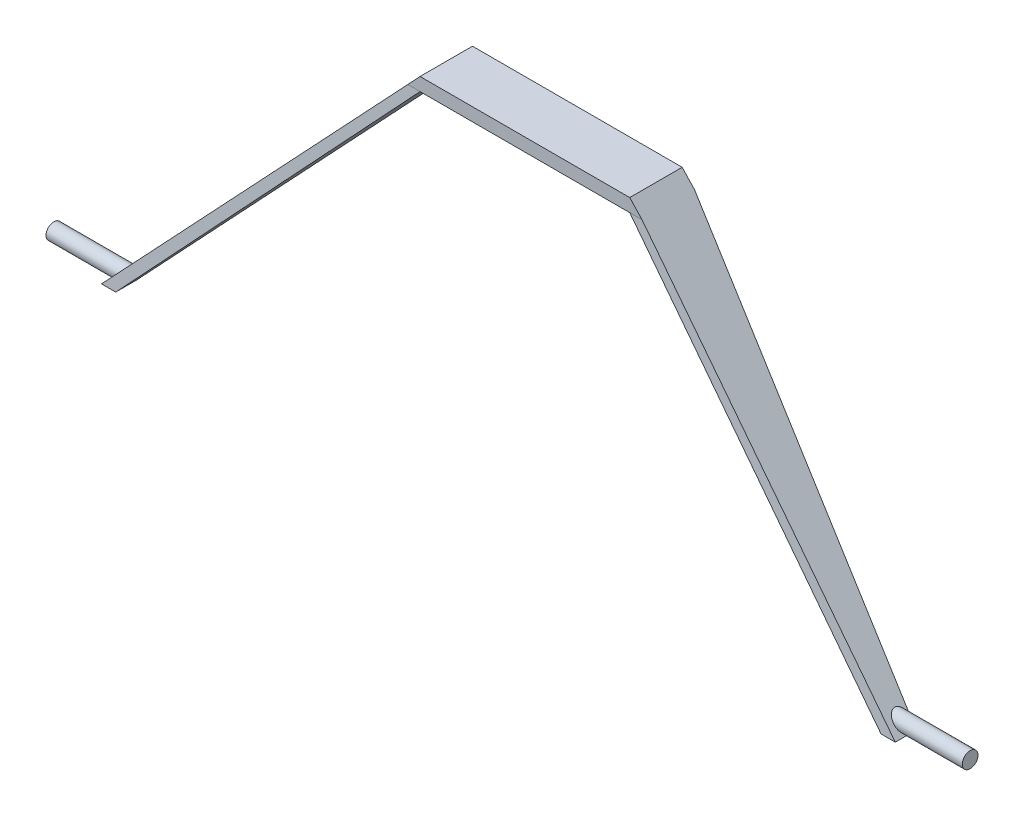
ISO-10303-21;
HEADER;
FILE_DESCRIPTION(('STEP AP214'),'2;1');
FILE_NAME('part.step','',(''),(''),'','','');
FILE_SCHEMA(('AUTOMOTIVE_DESIGN { 1 0 10303 214 1 1 1 1 }'));
ENDSEC;
DATA;
#1=APPLICATION_CONTEXT('core data for automotive mechanical design processes');
#2=APPLICATION_PROTOCOL_DEFINITION('international standard','automotive_design',2000,#1);
#3=PRODUCT_CONTEXT('',#1,'mechanical');
#4=PRODUCT('Part','Part','',(#3));
#5=PRODUCT_RELATED_PRODUCT_CATEGORY('part','',(#4));
#6=PRODUCT_DEFINITION_FORMATION('','',#4);
#7=PRODUCT_DEFINITION_CONTEXT('part definition',#1,'design');
#8=PRODUCT_DEFINITION('design','',#6,#7);
#9=PRODUCT_DEFINITION_SHAPE('','',#8);
#10=(LENGTH_UNIT() NAMED_UNIT(*) SI_UNIT(.MILLI.,.METRE.));
#11=(NAMED_UNIT(*) PLANE_ANGLE_UNIT() SI_UNIT($,.RADIAN.));
#12=(NAMED_UNIT(*) SI_UNIT($,.STERADIAN.) SOLID_ANGLE_UNIT());
#13=UNCERTAINTY_MEASURE_WITH_UNIT(LENGTH_MEASURE(1.E-05),#10,'distance_accuracy_value','');
#14=(GEOMETRIC_REPRESENTATION_CONTEXT(3) GLOBAL_UNCERTAINTY_ASSIGNED_CONTEXT((#13)) GLOBAL_UNIT_ASSIGNED_CONTEXT((#10,
#11,#12)) REPRESENTATION_CONTEXT('',''));
#15=CARTESIAN_POINT('',(0.,0.,0.));
#16=DIRECTION('',(0.,0.,1.));
#17=DIRECTION('',(1.,0.,0.));
#18=AXIS2_PLACEMENT_3D('',#15,#16,#17);
#19=CARTESIAN_POINT('',(203.2,241.3,-101.6));
#20=DIRECTION('',(0.730491181160132,0.682922128977584,0.));
#21=DIRECTION('',(-0.682922128977584,0.730491181160132,0.));
#22=AXIS2_PLACEMENT_3D('',#19,#20,#21);
#23=PLANE('',#22);
#24=DIRECTION('',(0.,0.,1.));
#25=VECTOR('',#24,1.);
#26=CARTESIAN_POINT('',(769.187266427381,-364.111201703355,-101.6));
#27=LINE('',#26,#25);
#28=CARTESIAN_POINT('',(769.18726642738,-364.111201703354,10.9518570639748));
#29=VERTEX_POINT('',#28);
#30=CARTESIAN_POINT('',(769.187266427381,-364.111201703355,51.3823695292059));
#31=VERTEX_POINT('',#30);
#32=EDGE_CURVE('E233',#29,#31,#27,.T.);
#33=ORIENTED_EDGE('',*,*,#32,.F.);
#34=DIRECTION('',(0.676162571687912,-0.723260785805915,0.140349607636784));
#35=VECTOR('',#34,1.);
#36=CARTESIAN_POINT('',(716.188478747164,-307.420774830618,-0.0489870637551265));
#37=LINE('',#36,#35);
#38=CARTESIAN_POINT('',(226.945970551598,215.9,-101.6));
#39=VERTEX_POINT('',#38);
#40=EDGE_CURVE('E215',#39,#29,#37,.T.);
#41=ORIENTED_EDGE('',*,*,#40,.F.);
#42=DIRECTION('',(-0.682922128977583,0.730491181160132,0.));
#43=VECTOR('',#42,1.);
#44=CARTESIAN_POINT('',(203.2,241.3,-101.6));
#45=LINE('',#44,#43);
#46=CARTESIAN_POINT('',(203.2,241.3,-101.6));
#47=VERTEX_POINT('',#46);
#48=EDGE_CURVE('E165',#39,#47,#45,.T.);
#49=ORIENTED_EDGE('',*,*,#48,.T.);
#50=DIRECTION('',(0.,0.,1.));
#51=VECTOR('',#50,1.);
#52=CARTESIAN_POINT('',(203.2,241.3,-101.6));
#53=LINE('',#52,#51);
#54=CARTESIAN_POINT('',(203.2,241.3,0.));
#55=VERTEX_POINT('',#54);
#56=EDGE_CURVE('E155',#47,#55,#53,.T.);
#57=ORIENTED_EDGE('',*,*,#56,.T.);
#58=DIRECTION('',(-0.682922128977584,0.730491181160132,0.));
#59=VECTOR('',#58,1.);
#60=CARTESIAN_POINT('',(713.347967728877,-304.382407554465,0.));
#61=LINE('',#60,#59);
#62=CARTESIAN_POINT('',(226.945970551598,215.9,0.));
#63=VERTEX_POINT('',#62);
#64=EDGE_CURVE('E207',#63,#55,#61,.T.);
#65=ORIENTED_EDGE('',*,*,#64,.F.);
#66=DIRECTION('',(-0.681496635621806,0.728966394832361,-0.0645780987740408));
#67=VECTOR('',#66,1.);
#68=CARTESIAN_POINT('',(723.937929376008,-315.71001470586,47.094577037175));
#69=LINE('',#68,#67);
#70=EDGE_CURVE('E203',#31,#63,#69,.T.);
#71=ORIENTED_EDGE('',*,*,#70,.F.);
#72=EDGE_LOOP('',(#33,#41,#49,#57,#65,#71));
#73=FACE_BOUND('',#72,.T.);
#74=CARTESIAN_POINT('',(754.684005766055,-348.59771405722,23.6894465081378));
#75=DIRECTION('',(0.730491181160132,0.682922128977584,0.));
#76=DIRECTION('',(0.682922128977584,-0.730491181160132,0.));
#77=AXIS2_PLACEMENT_3D('',#74,#75,#76);
#78=ELLIPSE('',#77,20.8626748591222,15.24);
#79=CARTESIAN_POINT('',(768.931588097014,-363.83771405722,23.6894465081378));
#80=VERTEX_POINT('',#79);
#81=EDGE_CURVE('E11',#80,#80,#78,.F.);
#82=ORIENTED_EDGE('',*,*,#81,.T.);
#83=EDGE_LOOP('',(#82));
#84=FACE_BOUND('',#83,.T.);
#85=ADVANCED_FACE('F41',(#73,#84),#23,.T.);
#86=CARTESIAN_POINT('',(-203.2,241.3,-101.6));
#87=DIRECTION('',(-0.730491181160132,0.682922128977583,0.));
#88=DIRECTION('',(-0.682922128977583,-0.730491181160132,0.));
#89=AXIS2_PLACEMENT_3D('',#86,#87,#88);
#90=PLANE('',#89);
#91=DIRECTION('',(0.,0.,-1.));
#92=VECTOR('',#91,1.);
#93=CARTESIAN_POINT('',(-769.187266427381,-364.111201703355,-101.6));
#94=LINE('',#93,#92);
#95=CARTESIAN_POINT('',(-769.187266427381,-364.111201703355,51.3823695292059));
#96=VERTEX_POINT('',#95);
#97=CARTESIAN_POINT('',(-769.187266427381,-364.111201703355,23.7425171080954));
#98=VERTEX_POINT('',#97);
#99=EDGE_CURVE('E120',#96,#98,#94,.T.);
#100=ORIENTED_EDGE('',*,*,#99,.F.);
#101=DIRECTION('',(0.681496635621806,0.728966394832361,-0.0645780987740409));
#102=VECTOR('',#101,1.);
#103=CARTESIAN_POINT('',(-723.937929376007,-315.71001470586,47.094577037175));
#104=LINE('',#103,#102);
#105=CARTESIAN_POINT('',(-226.945970551598,215.9,0.));
#106=VERTEX_POINT('',#105);
#107=EDGE_CURVE('E200',#96,#106,#104,.T.);
#108=ORIENTED_EDGE('',*,*,#107,.T.);
#109=DIRECTION('',(0.682922128977583,0.730491181160132,0.));
#110=VECTOR('',#109,1.);
#111=CARTESIAN_POINT('',(-713.347967728877,-304.382407554465,0.));
#112=LINE('',#111,#110);
#113=CARTESIAN_POINT('',(-203.2,241.3,0.));
#114=VERTEX_POINT('',#113);
#115=EDGE_CURVE('E194',#106,#114,#112,.T.);
#116=ORIENTED_EDGE('',*,*,#115,.T.);
#117=DIRECTION('',(0.,0.,1.));
#118=VECTOR('',#117,1.);
#119=CARTESIAN_POINT('',(-203.2,241.3,-101.6));
#120=LINE('',#119,#118);
#121=CARTESIAN_POINT('',(-203.2,241.3,-101.6));
#122=VERTEX_POINT('',#121);
#123=EDGE_CURVE('E143',#122,#114,#120,.T.);
#124=ORIENTED_EDGE('',*,*,#123,.F.);
#125=DIRECTION('',(-0.682922128977583,-0.730491181160132,0.));
#126=VECTOR('',#125,1.);
#127=CARTESIAN_POINT('',(-203.2,241.3,-101.6));
#128=LINE('',#127,#126);
#129=CARTESIAN_POINT('',(-226.945970551598,215.9,-101.6));
#130=VERTEX_POINT('',#129);
#131=EDGE_CURVE('E172',#122,#130,#128,.T.);
#132=ORIENTED_EDGE('',*,*,#131,.T.);
#133=DIRECTION('',(-0.676162571687912,-0.723260785805915,0.140349607636784));
#134=VECTOR('',#133,1.);
#135=CARTESIAN_POINT('',(-716.188478747163,-307.420774830618,-0.048987063755182));
#136=LINE('',#135,#134);
#137=CARTESIAN_POINT('',(-769.187266427381,-364.111201703355,10.9518570639749));
#138=VERTEX_POINT('',#137);
#139=EDGE_CURVE('E133',#130,#138,#136,.T.);
#140=ORIENTED_EDGE('',*,*,#139,.T.);
#141=EDGE_CURVE('E57',#98,#138,#94,.T.);
#142=ORIENTED_EDGE('',*,*,#141,.F.);
#143=CARTESIAN_POINT('',(-754.939684096422,-348.871201703355,23.7425171080954));
#144=DIRECTION('',(-0.730491181160132,0.682922128977583,0.));
#145=DIRECTION('',(-0.682922128977583,-0.730491181160132,0.));
#146=AXIS2_PLACEMENT_3D('',#143,#144,#145);
#147=ELLIPSE('',#146,20.8626748591222,15.24);
#148=EDGE_CURVE('E50',#98,#98,#147,.T.);
#149=ORIENTED_EDGE('',*,*,#148,.F.);
#150=EDGE_LOOP('',(#100,#108,#116,#124,#132,#140,#142,#149));
#151=FACE_BOUND('',#150,.T.);
#152=ADVANCED_FACE('F43',(#151),#90,.T.);
#153=CARTESIAN_POINT('',(-203.2,241.3,-101.6));
#154=DIRECTION('',(0.,1.,0.));
#155=DIRECTION('',(-1.,0.,0.));
#156=AXIS2_PLACEMENT_3D('',#153,#154,#155);
#157=PLANE('',#156);
#158=DIRECTION('',(1.,0.,0.));
#159=VECTOR('',#158,1.);
#160=CARTESIAN_POINT('',(-1297.03997230565,241.3,0.));
#161=LINE('',#160,#159);
#162=EDGE_CURVE('E189',#114,#55,#161,.T.);
#163=ORIENTED_EDGE('',*,*,#162,.T.);
#164=ORIENTED_EDGE('',*,*,#56,.F.);
#165=DIRECTION('',(-1.,0.,0.));
#166=VECTOR('',#165,1.);
#167=CARTESIAN_POINT('',(-203.2,241.3,-101.6));
#168=LINE('',#167,#166);
#169=EDGE_CURVE('E151',#47,#122,#168,.T.);
#170=ORIENTED_EDGE('',*,*,#169,.T.);
#171=ORIENTED_EDGE('',*,*,#123,.T.);
#172=EDGE_LOOP('',(#163,#164,#170,#171));
#173=FACE_BOUND('',#172,.T.);
#174=ADVANCED_FACE('F282',(#173),#157,.T.);
#175=CARTESIAN_POINT('',(762.071663752112,-386.209201703355,-101.6));
#176=DIRECTION('',(-0.732932920293633,-0.680300914559025,0.));
#177=DIRECTION('',(0.680300914559025,-0.732932920293633,0.));
#178=AXIS2_PLACEMENT_3D('',#175,#176,#177);
#179=PLANE('',#178);
#180=DIRECTION('',(0.,0.,-1.));
#181=VECTOR('',#180,1.);
#182=CARTESIAN_POINT('',(741.56052392788,-364.111201703355,-101.6));
#183=LINE('',#182,#181);
#184=CARTESIAN_POINT('',(741.56052392788,-364.111201703355,51.3823695292059));
#185=VERTEX_POINT('',#184);
#186=CARTESIAN_POINT('',(741.560523927879,-364.111201703354,10.9518570639748));
#187=VERTEX_POINT('',#186);
#188=EDGE_CURVE('E65',#185,#187,#183,.T.);
#189=ORIENTED_EDGE('',*,*,#188,.F.);
#190=DIRECTION('',(0.678871413535743,-0.731392824819506,0.0647930527643605));
#191=VECTOR('',#190,1.);
#192=CARTESIAN_POINT('',(755.256449466988,-378.866723100837,52.6895402369698));
#193=LINE('',#192,#191);
#194=CARTESIAN_POINT('',(203.2,215.9,0.));
#195=VERTEX_POINT('',#194);
#196=EDGE_CURVE('E182',#195,#185,#193,.T.);
#197=ORIENTED_EDGE('',*,*,#196,.F.);
#198=DIRECTION('',(0.,0.,1.));
#199=VECTOR('',#198,1.);
#200=CARTESIAN_POINT('',(203.2,215.9,-101.6));
#201=LINE('',#200,#199);
#202=CARTESIAN_POINT('',(203.2,215.9,-101.6));
#203=VERTEX_POINT('',#202);
#204=EDGE_CURVE('E150',#203,#195,#201,.T.);
#205=ORIENTED_EDGE('',*,*,#204,.F.);
#206=DIRECTION('',(-0.673522882906171,0.725630500986452,-0.140809453659583));
#207=VECTOR('',#206,1.);
#208=CARTESIAN_POINT('',(750.990746361577,-374.271000579751,12.9233780062889));
#209=LINE('',#208,#207);
#210=EDGE_CURVE('E175',#187,#203,#209,.T.);
#211=ORIENTED_EDGE('',*,*,#210,.F.);
#212=EDGE_LOOP('',(#189,#197,#205,#211));
#213=FACE_BOUND('',#212,.T.);
#214=ADVANCED_FACE('F289',(#213),#179,.T.);
#215=CARTESIAN_POINT('',(-203.2,215.9,-101.6));
#216=DIRECTION('',(0.,-1.,0.));
#217=DIRECTION('',(1.,0.,0.));
#218=AXIS2_PLACEMENT_3D('',#215,#216,#217);
#219=PLANE('',#218);
#220=DIRECTION('',(1.,0.,0.));
#221=VECTOR('',#220,1.);
#222=CARTESIAN_POINT('',(-1297.03997230565,215.9,0.));
#223=LINE('',#222,#221);
#224=CARTESIAN_POINT('',(-203.2,215.9,0.));
#225=VERTEX_POINT('',#224);
#226=EDGE_CURVE('E195',#225,#195,#223,.T.);
#227=ORIENTED_EDGE('',*,*,#226,.F.);
#228=DIRECTION('',(0.,0.,1.));
#229=VECTOR('',#228,1.);
#230=CARTESIAN_POINT('',(-203.2,215.9,-101.6));
#231=LINE('',#230,#229);
#232=CARTESIAN_POINT('',(-203.2,215.9,-101.6));
#233=VERTEX_POINT('',#232);
#234=EDGE_CURVE('E146',#233,#225,#231,.T.);
#235=ORIENTED_EDGE('',*,*,#234,.F.);
#236=DIRECTION('',(1.,0.,0.));
#237=VECTOR('',#236,1.);
#238=CARTESIAN_POINT('',(-203.2,215.9,-101.6));
#239=LINE('',#238,#237);
#240=EDGE_CURVE('E168',#233,#203,#239,.T.);
#241=ORIENTED_EDGE('',*,*,#240,.T.);
#242=ORIENTED_EDGE('',*,*,#204,.T.);
#243=EDGE_LOOP('',(#227,#235,#241,#242));
#244=FACE_BOUND('',#243,.T.);
#245=ADVANCED_FACE('F266',(#244),#219,.T.);
#246=CARTESIAN_POINT('',(-762.071663752112,-386.209201703355,-101.6));
#247=DIRECTION('',(0.732932920293634,-0.680300914559025,0.));
#248=DIRECTION('',(0.680300914559025,0.732932920293634,0.));
#249=AXIS2_PLACEMENT_3D('',#246,#247,#248);
#250=PLANE('',#249);
#251=DIRECTION('',(0.,0.,1.));
#252=VECTOR('',#251,1.);
#253=CARTESIAN_POINT('',(-741.56052392788,-364.111201703355,-101.6));
#254=LINE('',#253,#252);
#255=CARTESIAN_POINT('',(-741.56052392788,-364.111201703355,10.9518570639749));
#256=VERTEX_POINT('',#255);
#257=CARTESIAN_POINT('',(-741.56052392788,-364.111201703355,51.3823695292059));
#258=VERTEX_POINT('',#257);
#259=EDGE_CURVE('E242',#256,#258,#254,.T.);
#260=ORIENTED_EDGE('',*,*,#259,.F.);
#261=DIRECTION('',(-0.673522882906171,-0.725630500986452,0.140809453659583));
#262=VECTOR('',#261,1.);
#263=CARTESIAN_POINT('',(-750.990746361577,-374.271000579751,12.9233780062889));
#264=LINE('',#263,#262);
#265=EDGE_CURVE('E178',#233,#256,#264,.T.);
#266=ORIENTED_EDGE('',*,*,#265,.F.);
#267=ORIENTED_EDGE('',*,*,#234,.T.);
#268=DIRECTION('',(0.678871413535743,0.731392824819506,-0.0647930527643606));
#269=VECTOR('',#268,1.);
#270=CARTESIAN_POINT('',(-755.256449466988,-378.866723100838,52.6895402369698));
#271=LINE('',#270,#269);
#272=EDGE_CURVE('E186',#258,#225,#271,.T.);
#273=ORIENTED_EDGE('',*,*,#272,.F.);
#274=EDGE_LOOP('',(#260,#266,#267,#273));
#275=FACE_BOUND('',#274,.T.);
#276=ADVANCED_FACE('F253',(#275),#250,.T.);
#277=CARTESIAN_POINT('',(0.,0.,-101.6));
#278=DIRECTION('',(0.,0.,1.));
#279=DIRECTION('',(1.,0.,0.));
#280=AXIS2_PLACEMENT_3D('',#277,#278,#279);
#281=PLANE('',#280);
#282=ORIENTED_EDGE('',*,*,#48,.F.);
#283=DIRECTION('',(-1.,0.,0.));
#284=VECTOR('',#283,1.);
#285=CARTESIAN_POINT('',(0.,215.9,-101.6));
#286=LINE('',#285,#284);
#287=EDGE_CURVE('E140',#39,#203,#286,.T.);
#288=ORIENTED_EDGE('',*,*,#287,.T.);
#289=ORIENTED_EDGE('',*,*,#240,.F.);
#290=DIRECTION('',(1.,0.,0.));
#291=VECTOR('',#290,1.);
#292=CARTESIAN_POINT('',(-1297.03997230565,215.9,-101.6));
#293=LINE('',#292,#291);
#294=EDGE_CURVE('E212',#130,#233,#293,.T.);
#295=ORIENTED_EDGE('',*,*,#294,.F.);
#296=ORIENTED_EDGE('',*,*,#131,.F.);
#297=ORIENTED_EDGE('',*,*,#169,.F.);
#298=EDGE_LOOP('',(#282,#288,#289,#295,#296,#297));
#299=FACE_BOUND('',#298,.T.);
#300=ADVANCED_FACE('F285',(#299),#281,.F.);
#301=CARTESIAN_POINT('',(-1297.03997230565,215.9,0.));
#302=DIRECTION('',(0.,-0.0882429953418222,-0.996098977899839));
#303=DIRECTION('',(0.,0.996098977899839,-0.0882429953418222));
#304=AXIS2_PLACEMENT_3D('',#301,#302,#303);
#305=PLANE('',#304);
#306=ORIENTED_EDGE('',*,*,#196,.T.);
#307=DIRECTION('',(1.,0.,0.));
#308=VECTOR('',#307,1.);
#309=CARTESIAN_POINT('',(-1297.03997230565,-364.111201703355,51.3823695292059));
#310=LINE('',#309,#308);
#311=EDGE_CURVE('E229',#185,#31,#310,.T.);
#312=ORIENTED_EDGE('',*,*,#311,.T.);
#313=ORIENTED_EDGE('',*,*,#70,.T.);
#314=EDGE_CURVE('E196',#195,#63,#223,.T.);
#315=ORIENTED_EDGE('',*,*,#314,.F.);
#316=EDGE_LOOP('',(#306,#312,#313,#315));
#317=FACE_BOUND('',#316,.T.);
#318=ADVANCED_FACE('F290',(#317),#305,.F.);
#319=ORIENTED_EDGE('',*,*,#107,.F.);
#320=DIRECTION('',(1.,0.,0.));
#321=VECTOR('',#320,1.);
#322=CARTESIAN_POINT('',(-1297.03997230565,-364.111201703355,51.3823695292059));
#323=LINE('',#322,#321);
#324=EDGE_CURVE('E123',#96,#258,#323,.T.);
#325=ORIENTED_EDGE('',*,*,#324,.T.);
#326=ORIENTED_EDGE('',*,*,#272,.T.);
#327=EDGE_CURVE('E190',#106,#225,#223,.T.);
#328=ORIENTED_EDGE('',*,*,#327,.F.);
#329=EDGE_LOOP('',(#319,#325,#326,#328));
#330=FACE_BOUND('',#329,.T.);
#331=ADVANCED_FACE('F257',(#330),#305,.F.);
#332=CARTESIAN_POINT('',(-1297.03997230565,241.3,0.));
#333=DIRECTION('',(0.,0.,-1.));
#334=DIRECTION('',(-1.,0.,0.));
#335=AXIS2_PLACEMENT_3D('',#332,#333,#334);
#336=PLANE('',#335);
#337=ORIENTED_EDGE('',*,*,#327,.T.);
#338=ORIENTED_EDGE('',*,*,#226,.T.);
#339=ORIENTED_EDGE('',*,*,#314,.T.);
#340=ORIENTED_EDGE('',*,*,#64,.T.);
#341=ORIENTED_EDGE('',*,*,#162,.F.);
#342=ORIENTED_EDGE('',*,*,#115,.F.);
#343=EDGE_LOOP('',(#337,#338,#339,#340,#341,#342));
#344=FACE_BOUND('',#343,.T.);
#345=ADVANCED_FACE('F262',(#344),#336,.F.);
#346=CARTESIAN_POINT('',(-1297.03997230565,215.9,-101.6));
#347=DIRECTION('',(0.,0.190497645594452,0.981687652475557));
#348=DIRECTION('',(0.,-0.981687652475557,0.190497645594452));
#349=AXIS2_PLACEMENT_3D('',#346,#347,#348);
#350=PLANE('',#349);
#351=ORIENTED_EDGE('',*,*,#265,.T.);
#352=DIRECTION('',(-1.,0.,0.));
#353=VECTOR('',#352,1.);
#354=CARTESIAN_POINT('',(-1297.03997230565,-364.111201703355,10.9518570639748));
#355=LINE('',#354,#353);
#356=EDGE_CURVE('E135',#256,#138,#355,.T.);
#357=ORIENTED_EDGE('',*,*,#356,.T.);
#358=ORIENTED_EDGE('',*,*,#139,.F.);
#359=ORIENTED_EDGE('',*,*,#294,.T.);
#360=EDGE_LOOP('',(#351,#357,#358,#359));
#361=FACE_BOUND('',#360,.T.);
#362=ADVANCED_FACE('F247',(#361),#350,.F.);
#363=ORIENTED_EDGE('',*,*,#40,.T.);
#364=DIRECTION('',(-1.,0.,0.));
#365=VECTOR('',#364,1.);
#366=CARTESIAN_POINT('',(-1297.03997230565,-364.111201703355,10.9518570639748));
#367=LINE('',#366,#365);
#368=EDGE_CURVE('E128',#29,#187,#367,.T.);
#369=ORIENTED_EDGE('',*,*,#368,.T.);
#370=ORIENTED_EDGE('',*,*,#210,.T.);
#371=ORIENTED_EDGE('',*,*,#287,.F.);
#372=EDGE_LOOP('',(#363,#369,#370,#371));
#373=FACE_BOUND('',#372,.T.);
#374=ADVANCED_FACE('F292',(#373),#350,.F.);
#375=CARTESIAN_POINT('',(-703.882791672705,-348.871201703355,23.7425171080954));
#376=DIRECTION('',(-1.,0.,0.));
#377=DIRECTION('',(0.,0.,1.));
#378=AXIS2_PLACEMENT_3D('',#375,#376,#377);
#379=CYLINDRICAL_SURFACE('',#378,15.24);
#380=ORIENTED_EDGE('',*,*,#148,.T.);
#381=EDGE_LOOP('',(#380));
#382=FACE_BOUND('',#381,.T.);
#383=CARTESIAN_POINT('',(-889.071663752112,-348.871201703355,23.7425171080954));
#384=DIRECTION('',(-1.,0.,0.));
#385=DIRECTION('',(0.,0.,1.));
#386=AXIS2_PLACEMENT_3D('',#383,#384,#385);
#387=CIRCLE('',#386,15.24);
#388=CARTESIAN_POINT('',(-889.071663752112,-348.871201703355,38.9825171080954));
#389=VERTEX_POINT('',#388);
#390=EDGE_CURVE('E221',#389,#389,#387,.T.);
#391=ORIENTED_EDGE('',*,*,#390,.F.);
#392=EDGE_LOOP('',(#391));
#393=FACE_BOUND('',#392,.T.);
#394=ADVANCED_FACE('F137',(#382,#393),#379,.T.);
#395=CARTESIAN_POINT('',(-889.071663752112,-348.871201703355,23.7425171080954));
#396=DIRECTION('',(-1.,0.,0.));
#397=DIRECTION('',(0.,0.,1.));
#398=AXIS2_PLACEMENT_3D('',#395,#396,#397);
#399=PLANE('',#398);
#400=ORIENTED_EDGE('',*,*,#390,.T.);
#401=EDGE_LOOP('',(#400));
#402=FACE_BOUND('',#401,.T.);
#403=ADVANCED_FACE('F300',(#402),#399,.T.);
#404=CARTESIAN_POINT('',(703.627113342338,-348.59771405722,23.6894465081378));
#405=DIRECTION('',(1.,0.,0.));
#406=DIRECTION('',(0.,0.,-1.));
#407=AXIS2_PLACEMENT_3D('',#404,#405,#406);
#408=CYLINDRICAL_SURFACE('',#407,15.24);
#409=ORIENTED_EDGE('',*,*,#81,.F.);
#410=EDGE_LOOP('',(#409));
#411=FACE_BOUND('',#410,.T.);
#412=CARTESIAN_POINT('',(886.531663752112,-348.59771405722,23.6894465081378));
#413=DIRECTION('',(-1.,0.,0.));
#414=DIRECTION('',(0.,0.,1.));
#415=AXIS2_PLACEMENT_3D('',#412,#413,#414);
#416=CIRCLE('',#415,15.24);
#417=CARTESIAN_POINT('',(886.531663752112,-348.59771405722,38.9294465081378));
#418=VERTEX_POINT('',#417);
#419=EDGE_CURVE('E225',#418,#418,#416,.T.);
#420=ORIENTED_EDGE('',*,*,#419,.T.);
#421=EDGE_LOOP('',(#420));
#422=FACE_BOUND('',#421,.T.);
#423=ADVANCED_FACE('F357',(#411,#422),#408,.T.);
#424=CARTESIAN_POINT('',(886.531663752112,-348.59771405722,23.6894465081378));
#425=DIRECTION('',(-1.,0.,0.));
#426=DIRECTION('',(0.,0.,1.));
#427=AXIS2_PLACEMENT_3D('',#424,#425,#426);
#428=PLANE('',#427);
#429=ORIENTED_EDGE('',*,*,#419,.F.);
#430=EDGE_LOOP('',(#429));
#431=FACE_BOUND('',#430,.T.);
#432=ADVANCED_FACE('F364',(#431),#428,.F.);
#433=CARTESIAN_POINT('',(955.262170271328,-364.111201703355,53.34));
#434=DIRECTION('',(0.,1.,0.));
#435=DIRECTION('',(0.,0.,1.));
#436=AXIS2_PLACEMENT_3D('',#433,#434,#435);
#437=PLANE('',#436);
#438=ORIENTED_EDGE('',*,*,#188,.T.);
#439=ORIENTED_EDGE('',*,*,#368,.F.);
#440=ORIENTED_EDGE('',*,*,#32,.T.);
#441=ORIENTED_EDGE('',*,*,#311,.F.);
#442=EDGE_LOOP('',(#438,#439,#440,#441));
#443=FACE_BOUND('',#442,.T.);
#444=ADVANCED_FACE('F291',(#443),#437,.F.);
#445=ORIENTED_EDGE('',*,*,#99,.T.);
#446=ORIENTED_EDGE('',*,*,#141,.T.);
#447=ORIENTED_EDGE('',*,*,#356,.F.);
#448=ORIENTED_EDGE('',*,*,#259,.T.);
#449=ORIENTED_EDGE('',*,*,#324,.F.);
#450=EDGE_LOOP('',(#445,#446,#447,#448,#449));
#451=FACE_BOUND('',#450,.T.);
#452=ADVANCED_FACE('F121',(#451),#437,.F.);
#453=CLOSED_SHELL('',(#85,#152,#174,#214,#245,#276,#300,#318,#331,#345,#362,#374,#394,#403,#423,
#432,#444,#452));
#454=MANIFOLD_SOLID_BREP('B2',#453);
#455=ADVANCED_BREP_SHAPE_REPRESENTATION('',(#18,#454),#14);
#456=SHAPE_DEFINITION_REPRESENTATION(#9,#455);
ENDSEC;
END-ISO-10303-21;
